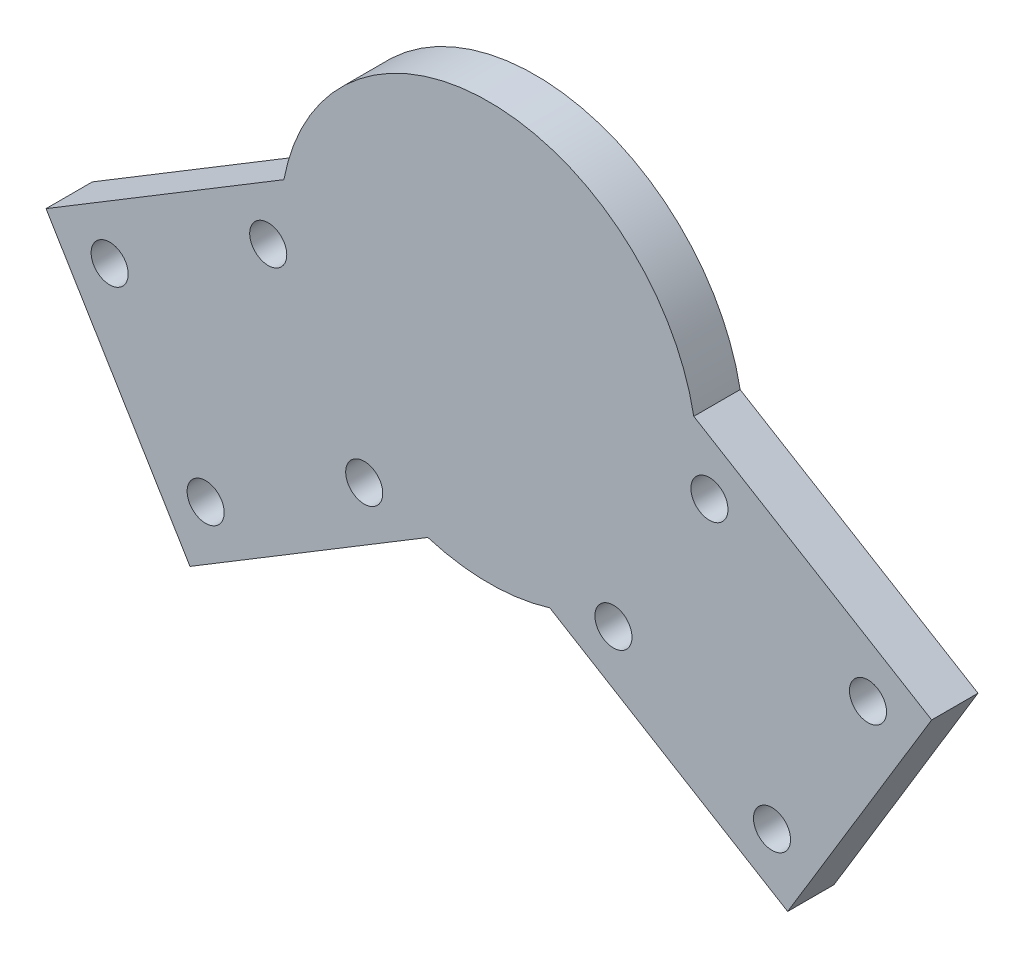
ISO-10303-21;
HEADER;
FILE_DESCRIPTION(('STEP AP214'),'2;1');
FILE_NAME('part.step','',(''),(''),'','','');
FILE_SCHEMA(('AUTOMOTIVE_DESIGN { 1 0 10303 214 1 1 1 1 }'));
ENDSEC;
DATA;
#1=APPLICATION_CONTEXT('core data for automotive mechanical design processes');
#2=APPLICATION_PROTOCOL_DEFINITION('international standard','automotive_design',2000,#1);
#3=PRODUCT_CONTEXT('',#1,'mechanical');
#4=PRODUCT('Part','Part','',(#3));
#5=PRODUCT_RELATED_PRODUCT_CATEGORY('part','',(#4));
#6=PRODUCT_DEFINITION_FORMATION('','',#4);
#7=PRODUCT_DEFINITION_CONTEXT('part definition',#1,'design');
#8=PRODUCT_DEFINITION('design','',#6,#7);
#9=PRODUCT_DEFINITION_SHAPE('','',#8);
#10=(LENGTH_UNIT() NAMED_UNIT(*) SI_UNIT(.MILLI.,.METRE.));
#11=(NAMED_UNIT(*) PLANE_ANGLE_UNIT() SI_UNIT($,.RADIAN.));
#12=(NAMED_UNIT(*) SI_UNIT($,.STERADIAN.) SOLID_ANGLE_UNIT());
#13=UNCERTAINTY_MEASURE_WITH_UNIT(LENGTH_MEASURE(1.E-05),#10,'distance_accuracy_value','');
#14=(GEOMETRIC_REPRESENTATION_CONTEXT(3) GLOBAL_UNCERTAINTY_ASSIGNED_CONTEXT((#13)) GLOBAL_UNIT_ASSIGNED_CONTEXT((#10,
#11,#12)) REPRESENTATION_CONTEXT('',''));
#15=CARTESIAN_POINT('',(0.,0.,0.));
#16=DIRECTION('',(0.,0.,1.));
#17=DIRECTION('',(1.,0.,0.));
#18=AXIS2_PLACEMENT_3D('',#15,#16,#17);
#19=CARTESIAN_POINT('',(0.,0.,0.));
#20=DIRECTION('',(0.,0.,1.));
#21=DIRECTION('',(1.,0.,0.));
#22=AXIS2_PLACEMENT_3D('',#19,#20,#21);
#23=PLANE('',#22);
#24=CARTESIAN_POINT('',(-40.9116262769101,-13.0772446234234,0.));
#25=DIRECTION('',(0.,0.,1.));
#26=DIRECTION('',(1.,0.,0.));
#27=AXIS2_PLACEMENT_3D('',#24,#25,#26);
#28=CIRCLE('',#27,2.);
#29=CARTESIAN_POINT('',(-38.9116262769101,-13.0772446234234,0.));
#30=VERTEX_POINT('',#29);
#31=EDGE_CURVE('E155',#30,#30,#28,.T.);
#32=ORIENTED_EDGE('',*,*,#31,.T.);
#33=EDGE_LOOP('',(#32));
#34=FACE_BOUND('',#33,.T.);
#35=CARTESIAN_POINT('',(13.4450159403913,-19.8289345320193,0.));
#36=DIRECTION('',(0.,0.,1.));
#37=DIRECTION('',(1.,0.,0.));
#38=AXIS2_PLACEMENT_3D('',#35,#36,#37);
#39=CIRCLE('',#38,2.);
#40=CARTESIAN_POINT('',(15.4450159403913,-19.8289345320193,0.));
#41=VERTEX_POINT('',#40);
#42=EDGE_CURVE('E214',#41,#41,#39,.T.);
#43=ORIENTED_EDGE('',*,*,#42,.T.);
#44=EDGE_LOOP('',(#43));
#45=FACE_BOUND('',#44,.T.);
#46=CARTESIAN_POINT('',(-30.5541660629487,-30.1863947459808,0.));
#47=DIRECTION('',(0.,0.,1.));
#48=DIRECTION('',(1.,0.,0.));
#49=AXIS2_PLACEMENT_3D('',#46,#47,#48);
#50=CIRCLE('',#49,2.00000000000001);
#51=CARTESIAN_POINT('',(-28.5541660629487,-30.1863947459808,0.));
#52=VERTEX_POINT('',#51);
#53=EDGE_CURVE('E218',#52,#52,#50,.T.);
#54=ORIENTED_EDGE('',*,*,#53,.T.);
#55=EDGE_LOOP('',(#54));
#56=FACE_BOUND('',#55,.T.);
#57=CARTESIAN_POINT('',(-13.4450159403913,-19.8289345320193,0.));
#58=DIRECTION('',(0.,0.,1.));
#59=DIRECTION('',(1.,0.,0.));
#60=AXIS2_PLACEMENT_3D('',#57,#58,#59);
#61=CIRCLE('',#60,2.);
#62=CARTESIAN_POINT('',(-11.4450159403913,-19.8289345320193,0.));
#63=VERTEX_POINT('',#62);
#64=EDGE_CURVE('E222',#63,#63,#61,.T.);
#65=ORIENTED_EDGE('',*,*,#64,.T.);
#66=EDGE_LOOP('',(#65));
#67=FACE_BOUND('',#66,.T.);
#68=CARTESIAN_POINT('',(-23.8024761543528,-2.71978440946193,0.));
#69=DIRECTION('',(0.,0.,1.));
#70=DIRECTION('',(1.,0.,0.));
#71=AXIS2_PLACEMENT_3D('',#68,#69,#70);
#72=CIRCLE('',#71,2.);
#73=CARTESIAN_POINT('',(-21.8024761543528,-2.71978440946193,0.));
#74=VERTEX_POINT('',#73);
#75=EDGE_CURVE('E226',#74,#74,#72,.T.);
#76=ORIENTED_EDGE('',*,*,#75,.T.);
#77=EDGE_LOOP('',(#76));
#78=FACE_BOUND('',#77,.T.);
#79=CARTESIAN_POINT('',(23.8024761543528,-2.71978440946192,0.));
#80=DIRECTION('',(0.,0.,1.));
#81=DIRECTION('',(1.,0.,0.));
#82=AXIS2_PLACEMENT_3D('',#79,#80,#81);
#83=CIRCLE('',#82,2.);
#84=CARTESIAN_POINT('',(25.8024761543528,-2.71978440946192,0.));
#85=VERTEX_POINT('',#84);
#86=EDGE_CURVE('E230',#85,#85,#83,.T.);
#87=ORIENTED_EDGE('',*,*,#86,.T.);
#88=EDGE_LOOP('',(#87));
#89=FACE_BOUND('',#88,.T.);
#90=CARTESIAN_POINT('',(40.9116262769102,-13.0772446234234,0.));
#91=DIRECTION('',(0.,0.,1.));
#92=DIRECTION('',(1.,0.,0.));
#93=AXIS2_PLACEMENT_3D('',#90,#91,#92);
#94=CIRCLE('',#93,2.);
#95=CARTESIAN_POINT('',(42.9116262769102,-13.0772446234234,0.));
#96=VERTEX_POINT('',#95);
#97=EDGE_CURVE('E234',#96,#96,#94,.T.);
#98=ORIENTED_EDGE('',*,*,#97,.T.);
#99=EDGE_LOOP('',(#98));
#100=FACE_BOUND('',#99,.T.);
#101=CARTESIAN_POINT('',(30.5541660629487,-30.1863947459808,0.));
#102=DIRECTION('',(0.,0.,1.));
#103=DIRECTION('',(1.,0.,0.));
#104=AXIS2_PLACEMENT_3D('',#101,#102,#103);
#105=CIRCLE('',#104,2.);
#106=CARTESIAN_POINT('',(32.5541660629487,-30.1863947459808,0.));
#107=VERTEX_POINT('',#106);
#108=EDGE_CURVE('E238',#107,#107,#105,.T.);
#109=ORIENTED_EDGE('',*,*,#108,.T.);
#110=EDGE_LOOP('',(#109));
#111=FACE_BOUND('',#110,.T.);
#112=CARTESIAN_POINT('',(0.,0.,0.));
#113=DIRECTION('',(0.,0.,1.));
#114=DIRECTION('',(1.,0.,0.));
#115=AXIS2_PLACEMENT_3D('',#112,#113,#114);
#116=CIRCLE('',#115,22.5);
#117=CARTESIAN_POINT('',(22.1145536772038,4.1468681746678,0.));
#118=VERTEX_POINT('',#117);
#119=CARTESIAN_POINT('',(-22.1145536772038,4.14686817466779,0.));
#120=VERTEX_POINT('',#119);
#121=EDGE_CURVE('E203',#118,#120,#116,.T.);
#122=ORIENTED_EDGE('',*,*,#121,.F.);
#123=DIRECTION('',(0.85545750612787,-0.517873010698073,0.));
#124=VECTOR('',#123,1.);
#125=CARTESIAN_POINT('',(22.1145536772038,4.1468681746678,0.));
#126=LINE('',#125,#124);
#127=CARTESIAN_POINT('',(47.7782788610399,-11.3893221462744,0.));
#128=VERTEX_POINT('',#127);
#129=EDGE_CURVE('E151',#118,#128,#126,.T.);
#130=ORIENTED_EDGE('',*,*,#129,.T.);
#131=DIRECTION('',(0.517873010698073,0.85545750612787,0.));
#132=VECTOR('',#131,1.);
#133=CARTESIAN_POINT('',(32.2420885400977,-37.0530473301105,0.));
#134=LINE('',#133,#132);
#135=CARTESIAN_POINT('',(32.2420885400977,-37.0530473301105,0.));
#136=VERTEX_POINT('',#135);
#137=EDGE_CURVE('E142',#136,#128,#134,.T.);
#138=ORIENTED_EDGE('',*,*,#137,.F.);
#139=DIRECTION('',(0.85545750612787,-0.517873010698072,0.));
#140=VECTOR('',#139,1.);
#141=CARTESIAN_POINT('',(6.57836335626161,-21.5168570091683,0.));
#142=LINE('',#141,#140);
#143=CARTESIAN_POINT('',(6.57836335626161,-21.5168570091683,0.));
#144=VERTEX_POINT('',#143);
#145=EDGE_CURVE('E131',#144,#136,#142,.T.);
#146=ORIENTED_EDGE('',*,*,#145,.F.);
#147=CARTESIAN_POINT('',(-6.57836335626159,-21.5168570091683,0.));
#148=VERTEX_POINT('',#147);
#149=EDGE_CURVE('E168',#148,#144,#116,.T.);
#150=ORIENTED_EDGE('',*,*,#149,.F.);
#151=DIRECTION('',(-0.855457506127869,-0.517873010698073,0.));
#152=VECTOR('',#151,1.);
#153=CARTESIAN_POINT('',(-6.57836335626159,-21.5168570091683,0.));
#154=LINE('',#153,#152);
#155=CARTESIAN_POINT('',(-32.2420885400977,-37.0530473301105,0.));
#156=VERTEX_POINT('',#155);
#157=EDGE_CURVE('E173',#148,#156,#154,.T.);
#158=ORIENTED_EDGE('',*,*,#157,.T.);
#159=DIRECTION('',(-0.517873010698073,0.855457506127869,0.));
#160=VECTOR('',#159,1.);
#161=CARTESIAN_POINT('',(-32.2420885400977,-37.0530473301105,0.));
#162=LINE('',#161,#160);
#163=CARTESIAN_POINT('',(-47.7782788610399,-11.3893221462744,0.));
#164=VERTEX_POINT('',#163);
#165=EDGE_CURVE('E178',#156,#164,#162,.T.);
#166=ORIENTED_EDGE('',*,*,#165,.T.);
#167=DIRECTION('',(-0.855457506127869,-0.517873010698073,0.));
#168=VECTOR('',#167,1.);
#169=CARTESIAN_POINT('',(-22.1145536772038,4.14686817466778,0.));
#170=LINE('',#169,#168);
#171=EDGE_CURVE('E149',#120,#164,#170,.T.);
#172=ORIENTED_EDGE('',*,*,#171,.F.);
#173=EDGE_LOOP('',(#122,#130,#138,#146,#150,#158,#166,#172));
#174=FACE_BOUND('',#173,.T.);
#175=ADVANCED_FACE('F75',(#34,#45,#56,#67,#78,#89,#100,#111,#174),#23,.F.);
#176=CARTESIAN_POINT('',(0.,0.,5.));
#177=DIRECTION('',(0.,0.,1.));
#178=DIRECTION('',(1.,0.,0.));
#179=AXIS2_PLACEMENT_3D('',#176,#177,#178);
#180=PLANE('',#179);
#181=CARTESIAN_POINT('',(-40.9116262769101,-13.0772446234234,5.));
#182=DIRECTION('',(0.,0.,1.));
#183=DIRECTION('',(1.,0.,0.));
#184=AXIS2_PLACEMENT_3D('',#181,#182,#183);
#185=CIRCLE('',#184,2.);
#186=CARTESIAN_POINT('',(-38.9116262769101,-13.0772446234234,5.));
#187=VERTEX_POINT('',#186);
#188=EDGE_CURVE('E242',#187,#187,#185,.T.);
#189=ORIENTED_EDGE('',*,*,#188,.F.);
#190=EDGE_LOOP('',(#189));
#191=FACE_BOUND('',#190,.T.);
#192=CARTESIAN_POINT('',(13.4450159403913,-19.8289345320193,5.));
#193=DIRECTION('',(0.,0.,1.));
#194=DIRECTION('',(1.,0.,0.));
#195=AXIS2_PLACEMENT_3D('',#192,#193,#194);
#196=CIRCLE('',#195,2.);
#197=CARTESIAN_POINT('',(15.4450159403913,-19.8289345320193,5.));
#198=VERTEX_POINT('',#197);
#199=EDGE_CURVE('E255',#198,#198,#196,.T.);
#200=ORIENTED_EDGE('',*,*,#199,.F.);
#201=EDGE_LOOP('',(#200));
#202=FACE_BOUND('',#201,.T.);
#203=CARTESIAN_POINT('',(-30.5541660629487,-30.1863947459808,5.));
#204=DIRECTION('',(0.,0.,1.));
#205=DIRECTION('',(1.,0.,0.));
#206=AXIS2_PLACEMENT_3D('',#203,#204,#205);
#207=CIRCLE('',#206,2.00000000000001);
#208=CARTESIAN_POINT('',(-28.5541660629487,-30.1863947459808,5.));
#209=VERTEX_POINT('',#208);
#210=EDGE_CURVE('E261',#209,#209,#207,.T.);
#211=ORIENTED_EDGE('',*,*,#210,.F.);
#212=EDGE_LOOP('',(#211));
#213=FACE_BOUND('',#212,.T.);
#214=CARTESIAN_POINT('',(-13.4450159403913,-19.8289345320193,5.));
#215=DIRECTION('',(0.,0.,1.));
#216=DIRECTION('',(1.,0.,0.));
#217=AXIS2_PLACEMENT_3D('',#214,#215,#216);
#218=CIRCLE('',#217,2.);
#219=CARTESIAN_POINT('',(-11.4450159403913,-19.8289345320193,5.));
#220=VERTEX_POINT('',#219);
#221=EDGE_CURVE('E256',#220,#220,#218,.T.);
#222=ORIENTED_EDGE('',*,*,#221,.F.);
#223=EDGE_LOOP('',(#222));
#224=FACE_BOUND('',#223,.T.);
#225=CARTESIAN_POINT('',(-23.8024761543528,-2.71978440946193,5.));
#226=DIRECTION('',(0.,0.,1.));
#227=DIRECTION('',(1.,0.,0.));
#228=AXIS2_PLACEMENT_3D('',#225,#226,#227);
#229=CIRCLE('',#228,2.);
#230=CARTESIAN_POINT('',(-21.8024761543528,-2.71978440946193,5.));
#231=VERTEX_POINT('',#230);
#232=EDGE_CURVE('E260',#231,#231,#229,.T.);
#233=ORIENTED_EDGE('',*,*,#232,.F.);
#234=EDGE_LOOP('',(#233));
#235=FACE_BOUND('',#234,.T.);
#236=CARTESIAN_POINT('',(23.8024761543528,-2.71978440946192,5.));
#237=DIRECTION('',(0.,0.,1.));
#238=DIRECTION('',(1.,0.,0.));
#239=AXIS2_PLACEMENT_3D('',#236,#237,#238);
#240=CIRCLE('',#239,2.);
#241=CARTESIAN_POINT('',(25.8024761543528,-2.71978440946192,5.));
#242=VERTEX_POINT('',#241);
#243=EDGE_CURVE('E251',#242,#242,#240,.T.);
#244=ORIENTED_EDGE('',*,*,#243,.F.);
#245=EDGE_LOOP('',(#244));
#246=FACE_BOUND('',#245,.T.);
#247=CARTESIAN_POINT('',(40.9116262769102,-13.0772446234234,5.));
#248=DIRECTION('',(0.,0.,1.));
#249=DIRECTION('',(1.,0.,0.));
#250=AXIS2_PLACEMENT_3D('',#247,#248,#249);
#251=CIRCLE('',#250,2.);
#252=CARTESIAN_POINT('',(42.9116262769102,-13.0772446234234,5.));
#253=VERTEX_POINT('',#252);
#254=EDGE_CURVE('E247',#253,#253,#251,.T.);
#255=ORIENTED_EDGE('',*,*,#254,.F.);
#256=EDGE_LOOP('',(#255));
#257=FACE_BOUND('',#256,.T.);
#258=CARTESIAN_POINT('',(30.5541660629487,-30.1863947459808,5.));
#259=DIRECTION('',(0.,0.,1.));
#260=DIRECTION('',(1.,0.,0.));
#261=AXIS2_PLACEMENT_3D('',#258,#259,#260);
#262=CIRCLE('',#261,2.);
#263=CARTESIAN_POINT('',(32.5541660629487,-30.1863947459808,5.));
#264=VERTEX_POINT('',#263);
#265=EDGE_CURVE('E243',#264,#264,#262,.T.);
#266=ORIENTED_EDGE('',*,*,#265,.F.);
#267=EDGE_LOOP('',(#266));
#268=FACE_BOUND('',#267,.T.);
#269=CARTESIAN_POINT('',(0.,0.,5.));
#270=DIRECTION('',(0.,0.,1.));
#271=DIRECTION('',(1.,0.,0.));
#272=AXIS2_PLACEMENT_3D('',#269,#270,#271);
#273=CIRCLE('',#272,22.5);
#274=CARTESIAN_POINT('',(-6.57836335626159,-21.5168570091683,5.));
#275=VERTEX_POINT('',#274);
#276=CARTESIAN_POINT('',(6.57836335626161,-21.5168570091683,5.));
#277=VERTEX_POINT('',#276);
#278=EDGE_CURVE('E207',#275,#277,#273,.T.);
#279=ORIENTED_EDGE('',*,*,#278,.T.);
#280=DIRECTION('',(0.85545750612787,-0.517873010698072,0.));
#281=VECTOR('',#280,1.);
#282=CARTESIAN_POINT('',(6.57836335626161,-21.5168570091683,5.));
#283=LINE('',#282,#281);
#284=CARTESIAN_POINT('',(32.2420885400977,-37.0530473301105,5.));
#285=VERTEX_POINT('',#284);
#286=EDGE_CURVE('E158',#277,#285,#283,.T.);
#287=ORIENTED_EDGE('',*,*,#286,.T.);
#288=DIRECTION('',(0.517873010698073,0.85545750612787,0.));
#289=VECTOR('',#288,1.);
#290=CARTESIAN_POINT('',(32.2420885400977,-37.0530473301105,5.));
#291=LINE('',#290,#289);
#292=CARTESIAN_POINT('',(47.7782788610399,-11.3893221462744,5.));
#293=VERTEX_POINT('',#292);
#294=EDGE_CURVE('E147',#285,#293,#291,.T.);
#295=ORIENTED_EDGE('',*,*,#294,.T.);
#296=DIRECTION('',(0.85545750612787,-0.517873010698073,0.));
#297=VECTOR('',#296,1.);
#298=CARTESIAN_POINT('',(22.1145536772038,4.1468681746678,5.));
#299=LINE('',#298,#297);
#300=CARTESIAN_POINT('',(22.1145536772038,4.1468681746678,5.));
#301=VERTEX_POINT('',#300);
#302=EDGE_CURVE('E141',#301,#293,#299,.T.);
#303=ORIENTED_EDGE('',*,*,#302,.F.);
#304=CARTESIAN_POINT('',(-22.1145536772038,4.14686817466779,5.));
#305=VERTEX_POINT('',#304);
#306=EDGE_CURVE('E202',#301,#305,#273,.T.);
#307=ORIENTED_EDGE('',*,*,#306,.T.);
#308=DIRECTION('',(-0.855457506127869,-0.517873010698073,0.));
#309=VECTOR('',#308,1.);
#310=CARTESIAN_POINT('',(-22.1145536772038,4.14686817466778,5.));
#311=LINE('',#310,#309);
#312=CARTESIAN_POINT('',(-47.7782788610399,-11.3893221462744,5.));
#313=VERTEX_POINT('',#312);
#314=EDGE_CURVE('E177',#305,#313,#311,.T.);
#315=ORIENTED_EDGE('',*,*,#314,.T.);
#316=DIRECTION('',(-0.517873010698073,0.855457506127869,0.));
#317=VECTOR('',#316,1.);
#318=CARTESIAN_POINT('',(-32.2420885400977,-37.0530473301105,5.));
#319=LINE('',#318,#317);
#320=CARTESIAN_POINT('',(-32.2420885400977,-37.0530473301105,5.));
#321=VERTEX_POINT('',#320);
#322=EDGE_CURVE('E188',#321,#313,#319,.T.);
#323=ORIENTED_EDGE('',*,*,#322,.F.);
#324=DIRECTION('',(-0.855457506127869,-0.517873010698073,0.));
#325=VECTOR('',#324,1.);
#326=CARTESIAN_POINT('',(-6.57836335626159,-21.5168570091683,5.));
#327=LINE('',#326,#325);
#328=EDGE_CURVE('E172',#275,#321,#327,.T.);
#329=ORIENTED_EDGE('',*,*,#328,.F.);
#330=EDGE_LOOP('',(#279,#287,#295,#303,#307,#315,#323,#329));
#331=FACE_BOUND('',#330,.T.);
#332=ADVANCED_FACE('F278',(#191,#202,#213,#224,#235,#246,#257,#268,#331),#180,.T.);
#333=CARTESIAN_POINT('',(0.,0.,5.));
#334=DIRECTION('',(0.,0.,-1.));
#335=DIRECTION('',(-1.,0.,0.));
#336=AXIS2_PLACEMENT_3D('',#333,#334,#335);
#337=CYLINDRICAL_SURFACE('',#336,22.5);
#338=DIRECTION('',(0.,0.,-1.));
#339=VECTOR('',#338,1.);
#340=CARTESIAN_POINT('',(-22.1145536772038,4.14686817466779,5.));
#341=LINE('',#340,#339);
#342=EDGE_CURVE('E12',#305,#120,#341,.T.);
#343=ORIENTED_EDGE('',*,*,#342,.F.);
#344=ORIENTED_EDGE('',*,*,#306,.F.);
#345=DIRECTION('',(0.,0.,-1.));
#346=VECTOR('',#345,1.);
#347=CARTESIAN_POINT('',(22.1145536772038,4.1468681746678,5.));
#348=LINE('',#347,#346);
#349=EDGE_CURVE('E196',#301,#118,#348,.T.);
#350=ORIENTED_EDGE('',*,*,#349,.T.);
#351=ORIENTED_EDGE('',*,*,#121,.T.);
#352=EDGE_LOOP('',(#343,#344,#350,#351));
#353=FACE_BOUND('',#352,.T.);
#354=ADVANCED_FACE('F281',(#353),#337,.T.);
#355=DIRECTION('',(0.,0.,-1.));
#356=VECTOR('',#355,1.);
#357=CARTESIAN_POINT('',(-6.57836335626159,-21.5168570091683,5.));
#358=LINE('',#357,#356);
#359=EDGE_CURVE('E86',#148,#275,#358,.F.);
#360=ORIENTED_EDGE('',*,*,#359,.F.);
#361=ORIENTED_EDGE('',*,*,#149,.T.);
#362=DIRECTION('',(0.,0.,-1.));
#363=VECTOR('',#362,1.);
#364=CARTESIAN_POINT('',(6.57836335626161,-21.5168570091683,5.));
#365=LINE('',#364,#363);
#366=EDGE_CURVE('E95',#277,#144,#365,.T.);
#367=ORIENTED_EDGE('',*,*,#366,.F.);
#368=ORIENTED_EDGE('',*,*,#278,.F.);
#369=EDGE_LOOP('',(#360,#361,#367,#368));
#370=FACE_BOUND('',#369,.T.);
#371=ADVANCED_FACE('F306',(#370),#337,.T.);
#372=CARTESIAN_POINT('',(32.2420885400977,-37.0530473301105,5.));
#373=DIRECTION('',(-0.85545750612787,0.517873010698073,0.));
#374=DIRECTION('',(-0.517873010698073,-0.85545750612787,0.));
#375=AXIS2_PLACEMENT_3D('',#372,#373,#374);
#376=PLANE('',#375);
#377=ORIENTED_EDGE('',*,*,#137,.T.);
#378=DIRECTION('',(0.,0.,-1.));
#379=VECTOR('',#378,1.);
#380=CARTESIAN_POINT('',(47.7782788610399,-11.3893221462744,5.));
#381=LINE('',#380,#379);
#382=EDGE_CURVE('E79',#293,#128,#381,.T.);
#383=ORIENTED_EDGE('',*,*,#382,.F.);
#384=ORIENTED_EDGE('',*,*,#294,.F.);
#385=DIRECTION('',(0.,0.,-1.));
#386=VECTOR('',#385,1.);
#387=CARTESIAN_POINT('',(32.2420885400977,-37.0530473301105,5.));
#388=LINE('',#387,#386);
#389=EDGE_CURVE('E134',#285,#136,#388,.T.);
#390=ORIENTED_EDGE('',*,*,#389,.T.);
#391=EDGE_LOOP('',(#377,#383,#384,#390));
#392=FACE_BOUND('',#391,.T.);
#393=ADVANCED_FACE('F145',(#392),#376,.F.);
#394=CARTESIAN_POINT('',(22.1145536772038,4.1468681746678,5.));
#395=DIRECTION('',(0.517873010698072,0.85545750612787,0.));
#396=DIRECTION('',(-0.85545750612787,0.517873010698072,0.));
#397=AXIS2_PLACEMENT_3D('',#394,#395,#396);
#398=PLANE('',#397);
#399=ORIENTED_EDGE('',*,*,#129,.F.);
#400=ORIENTED_EDGE('',*,*,#349,.F.);
#401=ORIENTED_EDGE('',*,*,#302,.T.);
#402=ORIENTED_EDGE('',*,*,#382,.T.);
#403=EDGE_LOOP('',(#399,#400,#401,#402));
#404=FACE_BOUND('',#403,.T.);
#405=ADVANCED_FACE('F77',(#404),#398,.T.);
#406=CARTESIAN_POINT('',(6.57836335626161,-21.5168570091683,5.));
#407=DIRECTION('',(0.517873010698072,0.85545750612787,0.));
#408=DIRECTION('',(-0.85545750612787,0.517873010698073,0.));
#409=AXIS2_PLACEMENT_3D('',#406,#407,#408);
#410=PLANE('',#409);
#411=ORIENTED_EDGE('',*,*,#145,.T.);
#412=ORIENTED_EDGE('',*,*,#389,.F.);
#413=ORIENTED_EDGE('',*,*,#286,.F.);
#414=ORIENTED_EDGE('',*,*,#366,.T.);
#415=EDGE_LOOP('',(#411,#412,#413,#414));
#416=FACE_BOUND('',#415,.T.);
#417=ADVANCED_FACE('F133',(#416),#410,.F.);
#418=CARTESIAN_POINT('',(-32.2420885400977,-37.0530473301105,5.));
#419=DIRECTION('',(-0.855457506127869,-0.517873010698073,0.));
#420=DIRECTION('',(0.517873010698073,-0.855457506127869,0.));
#421=AXIS2_PLACEMENT_3D('',#418,#419,#420);
#422=PLANE('',#421);
#423=ORIENTED_EDGE('',*,*,#165,.F.);
#424=DIRECTION('',(0.,0.,-1.));
#425=VECTOR('',#424,1.);
#426=CARTESIAN_POINT('',(-32.2420885400977,-37.0530473301105,5.));
#427=LINE('',#426,#425);
#428=EDGE_CURVE('E169',#321,#156,#427,.T.);
#429=ORIENTED_EDGE('',*,*,#428,.F.);
#430=ORIENTED_EDGE('',*,*,#322,.T.);
#431=DIRECTION('',(0.,0.,-1.));
#432=VECTOR('',#431,1.);
#433=CARTESIAN_POINT('',(-47.7782788610399,-11.3893221462744,5.));
#434=LINE('',#433,#432);
#435=EDGE_CURVE('E165',#313,#164,#434,.T.);
#436=ORIENTED_EDGE('',*,*,#435,.T.);
#437=EDGE_LOOP('',(#423,#429,#430,#436));
#438=FACE_BOUND('',#437,.T.);
#439=ADVANCED_FACE('F328',(#438),#422,.T.);
#440=CARTESIAN_POINT('',(-6.57836335626159,-21.5168570091683,5.));
#441=DIRECTION('',(0.517873010698073,-0.855457506127869,0.));
#442=DIRECTION('',(0.855457506127869,0.517873010698073,0.));
#443=AXIS2_PLACEMENT_3D('',#440,#441,#442);
#444=PLANE('',#443);
#445=ORIENTED_EDGE('',*,*,#157,.F.);
#446=ORIENTED_EDGE('',*,*,#359,.T.);
#447=ORIENTED_EDGE('',*,*,#328,.T.);
#448=ORIENTED_EDGE('',*,*,#428,.T.);
#449=EDGE_LOOP('',(#445,#446,#447,#448));
#450=FACE_BOUND('',#449,.T.);
#451=ADVANCED_FACE('F284',(#450),#444,.T.);
#452=CARTESIAN_POINT('',(-22.1145536772038,4.14686817466778,5.));
#453=DIRECTION('',(0.517873010698073,-0.855457506127869,0.));
#454=DIRECTION('',(0.855457506127869,0.517873010698073,0.));
#455=AXIS2_PLACEMENT_3D('',#452,#453,#454);
#456=PLANE('',#455);
#457=ORIENTED_EDGE('',*,*,#171,.T.);
#458=ORIENTED_EDGE('',*,*,#435,.F.);
#459=ORIENTED_EDGE('',*,*,#314,.F.);
#460=ORIENTED_EDGE('',*,*,#342,.T.);
#461=EDGE_LOOP('',(#457,#458,#459,#460));
#462=FACE_BOUND('',#461,.T.);
#463=ADVANCED_FACE('F324',(#462),#456,.F.);
#464=CARTESIAN_POINT('',(30.5541660629487,-30.1863947459808,-5.));
#465=DIRECTION('',(0.,0.,1.));
#466=DIRECTION('',(1.,0.,0.));
#467=AXIS2_PLACEMENT_3D('',#464,#465,#466);
#468=CYLINDRICAL_SURFACE('',#467,2.);
#469=ORIENTED_EDGE('',*,*,#265,.T.);
#470=EDGE_LOOP('',(#469));
#471=FACE_BOUND('',#470,.T.);
#472=ORIENTED_EDGE('',*,*,#108,.F.);
#473=EDGE_LOOP('',(#472));
#474=FACE_BOUND('',#473,.T.);
#475=ADVANCED_FACE('F283',(#471,#474),#468,.F.);
#476=CARTESIAN_POINT('',(40.9116262769102,-13.0772446234234,-5.));
#477=DIRECTION('',(0.,0.,1.));
#478=DIRECTION('',(1.,0.,0.));
#479=AXIS2_PLACEMENT_3D('',#476,#477,#478);
#480=CYLINDRICAL_SURFACE('',#479,2.);
#481=ORIENTED_EDGE('',*,*,#254,.T.);
#482=EDGE_LOOP('',(#481));
#483=FACE_BOUND('',#482,.T.);
#484=ORIENTED_EDGE('',*,*,#97,.F.);
#485=EDGE_LOOP('',(#484));
#486=FACE_BOUND('',#485,.T.);
#487=ADVANCED_FACE('F384',(#483,#486),#480,.F.);
#488=CARTESIAN_POINT('',(23.8024761543528,-2.71978440946192,-5.));
#489=DIRECTION('',(0.,0.,1.));
#490=DIRECTION('',(1.,0.,0.));
#491=AXIS2_PLACEMENT_3D('',#488,#489,#490);
#492=CYLINDRICAL_SURFACE('',#491,2.);
#493=ORIENTED_EDGE('',*,*,#243,.T.);
#494=EDGE_LOOP('',(#493));
#495=FACE_BOUND('',#494,.T.);
#496=ORIENTED_EDGE('',*,*,#86,.F.);
#497=EDGE_LOOP('',(#496));
#498=FACE_BOUND('',#497,.T.);
#499=ADVANCED_FACE('F394',(#495,#498),#492,.F.);
#500=CARTESIAN_POINT('',(-23.8024761543528,-2.71978440946193,-5.));
#501=DIRECTION('',(0.,0.,1.));
#502=DIRECTION('',(1.,0.,0.));
#503=AXIS2_PLACEMENT_3D('',#500,#501,#502);
#504=CYLINDRICAL_SURFACE('',#503,2.);
#505=ORIENTED_EDGE('',*,*,#232,.T.);
#506=EDGE_LOOP('',(#505));
#507=FACE_BOUND('',#506,.T.);
#508=ORIENTED_EDGE('',*,*,#75,.F.);
#509=EDGE_LOOP('',(#508));
#510=FACE_BOUND('',#509,.T.);
#511=ADVANCED_FACE('F404',(#507,#510),#504,.F.);
#512=CARTESIAN_POINT('',(-13.4450159403913,-19.8289345320193,-5.));
#513=DIRECTION('',(0.,0.,1.));
#514=DIRECTION('',(1.,0.,0.));
#515=AXIS2_PLACEMENT_3D('',#512,#513,#514);
#516=CYLINDRICAL_SURFACE('',#515,2.);
#517=ORIENTED_EDGE('',*,*,#221,.T.);
#518=EDGE_LOOP('',(#517));
#519=FACE_BOUND('',#518,.T.);
#520=ORIENTED_EDGE('',*,*,#64,.F.);
#521=EDGE_LOOP('',(#520));
#522=FACE_BOUND('',#521,.T.);
#523=ADVANCED_FACE('F414',(#519,#522),#516,.F.);
#524=CARTESIAN_POINT('',(-30.5541660629487,-30.1863947459808,-5.));
#525=DIRECTION('',(0.,0.,1.));
#526=DIRECTION('',(1.,0.,0.));
#527=AXIS2_PLACEMENT_3D('',#524,#525,#526);
#528=CYLINDRICAL_SURFACE('',#527,2.00000000000001);
#529=ORIENTED_EDGE('',*,*,#210,.T.);
#530=EDGE_LOOP('',(#529));
#531=FACE_BOUND('',#530,.T.);
#532=ORIENTED_EDGE('',*,*,#53,.F.);
#533=EDGE_LOOP('',(#532));
#534=FACE_BOUND('',#533,.T.);
#535=ADVANCED_FACE('F424',(#531,#534),#528,.F.);
#536=CARTESIAN_POINT('',(13.4450159403913,-19.8289345320193,-5.));
#537=DIRECTION('',(0.,0.,1.));
#538=DIRECTION('',(1.,0.,0.));
#539=AXIS2_PLACEMENT_3D('',#536,#537,#538);
#540=CYLINDRICAL_SURFACE('',#539,2.);
#541=ORIENTED_EDGE('',*,*,#199,.T.);
#542=EDGE_LOOP('',(#541));
#543=FACE_BOUND('',#542,.T.);
#544=ORIENTED_EDGE('',*,*,#42,.F.);
#545=EDGE_LOOP('',(#544));
#546=FACE_BOUND('',#545,.T.);
#547=ADVANCED_FACE('F434',(#543,#546),#540,.F.);
#548=CARTESIAN_POINT('',(-40.9116262769101,-13.0772446234234,-5.));
#549=DIRECTION('',(0.,0.,1.));
#550=DIRECTION('',(1.,0.,0.));
#551=AXIS2_PLACEMENT_3D('',#548,#549,#550);
#552=CYLINDRICAL_SURFACE('',#551,2.);
#553=ORIENTED_EDGE('',*,*,#188,.T.);
#554=EDGE_LOOP('',(#553));
#555=FACE_BOUND('',#554,.T.);
#556=ORIENTED_EDGE('',*,*,#31,.F.);
#557=EDGE_LOOP('',(#556));
#558=FACE_BOUND('',#557,.T.);
#559=ADVANCED_FACE('F275',(#555,#558),#552,.F.);
#560=CLOSED_SHELL('',(#175,#332,#354,#371,#393,#405,#417,#439,#451,#463,#475,#487,#499,#511,
#523,#535,#547,#559));
#561=MANIFOLD_SOLID_BREP('B2',#560);
#562=ADVANCED_BREP_SHAPE_REPRESENTATION('',(#18,#561),#14);
#563=SHAPE_DEFINITION_REPRESENTATION(#9,#562);
ENDSEC;
END-ISO-10303-21;
